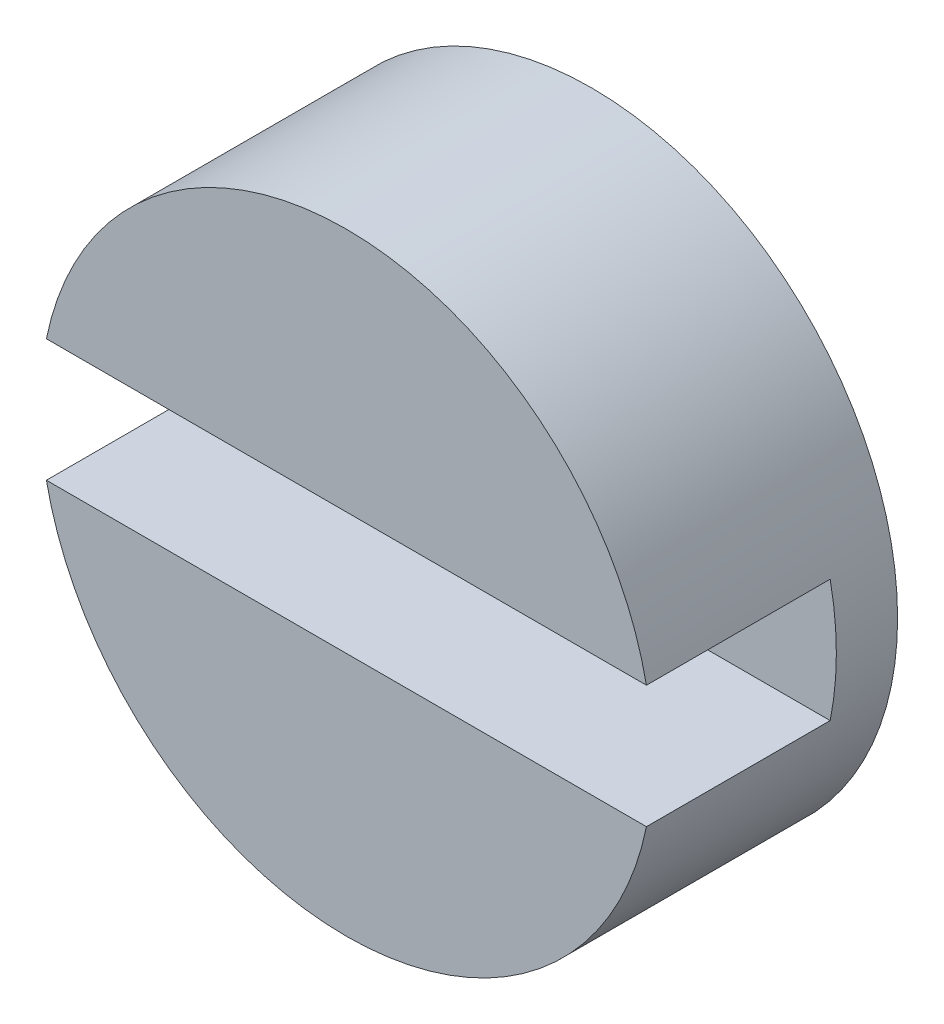
ISO-10303-21;
HEADER;
FILE_DESCRIPTION(('STEP AP214'),'2;1');
FILE_NAME('part.step','',(''),(''),'','','');
FILE_SCHEMA(('AUTOMOTIVE_DESIGN { 1 0 10303 214 1 1 1 1 }'));
ENDSEC;
DATA;
#1=APPLICATION_CONTEXT('core data for automotive mechanical design processes');
#2=APPLICATION_PROTOCOL_DEFINITION('international standard','automotive_design',2000,#1);
#3=PRODUCT_CONTEXT('',#1,'mechanical');
#4=PRODUCT('Part','Part','',(#3));
#5=PRODUCT_RELATED_PRODUCT_CATEGORY('part','',(#4));
#6=PRODUCT_DEFINITION_FORMATION('','',#4);
#7=PRODUCT_DEFINITION_CONTEXT('part definition',#1,'design');
#8=PRODUCT_DEFINITION('design','',#6,#7);
#9=PRODUCT_DEFINITION_SHAPE('','',#8);
#10=(LENGTH_UNIT() NAMED_UNIT(*) SI_UNIT(.MILLI.,.METRE.));
#11=(NAMED_UNIT(*) PLANE_ANGLE_UNIT() SI_UNIT($,.RADIAN.));
#12=(NAMED_UNIT(*) SI_UNIT($,.STERADIAN.) SOLID_ANGLE_UNIT());
#13=UNCERTAINTY_MEASURE_WITH_UNIT(LENGTH_MEASURE(1.E-05),#10,'distance_accuracy_value','');
#14=(GEOMETRIC_REPRESENTATION_CONTEXT(3) GLOBAL_UNCERTAINTY_ASSIGNED_CONTEXT((#13)) GLOBAL_UNIT_ASSIGNED_CONTEXT((#10,
#11,#12)) REPRESENTATION_CONTEXT('',''));
#15=CARTESIAN_POINT('',(0.,0.,0.));
#16=DIRECTION('',(0.,0.,1.));
#17=DIRECTION('',(1.,0.,0.));
#18=AXIS2_PLACEMENT_3D('',#15,#16,#17);
#19=CARTESIAN_POINT('',(0.,0.,20.));
#20=DIRECTION('',(0.,0.,1.));
#21=DIRECTION('',(1.,0.,0.));
#22=AXIS2_PLACEMENT_3D('',#19,#20,#21);
#23=PLANE('',#22);
#24=DIRECTION('',(1.,0.,0.));
#25=VECTOR('',#24,1.);
#26=CARTESIAN_POINT('',(0.,-5.,20.));
#27=LINE('',#26,#25);
#28=CARTESIAN_POINT('',(-24.4948974278318,-5.,20.));
#29=VERTEX_POINT('',#28);
#30=CARTESIAN_POINT('',(24.4948974278318,-5.,20.));
#31=VERTEX_POINT('',#30);
#32=EDGE_CURVE('E56',#29,#31,#27,.T.);
#33=ORIENTED_EDGE('',*,*,#32,.F.);
#34=CARTESIAN_POINT('',(0.,0.,20.));
#35=DIRECTION('',(0.,0.,1.));
#36=DIRECTION('',(1.,0.,0.));
#37=AXIS2_PLACEMENT_3D('',#34,#35,#36);
#38=CIRCLE('',#37,25.);
#39=EDGE_CURVE('E100',#29,#31,#38,.T.);
#40=ORIENTED_EDGE('',*,*,#39,.T.);
#41=EDGE_LOOP('',(#33,#40));
#42=FACE_BOUND('',#41,.T.);
#43=ADVANCED_FACE('F33',(#42),#23,.T.);
#44=CARTESIAN_POINT('',(0.,0.,20.));
#45=DIRECTION('',(0.,0.,-1.));
#46=DIRECTION('',(-1.,0.,0.));
#47=AXIS2_PLACEMENT_3D('',#44,#45,#46);
#48=CYLINDRICAL_SURFACE('',#47,25.);
#49=DIRECTION('',(0.,0.,-1.));
#50=VECTOR('',#49,1.);
#51=CARTESIAN_POINT('',(24.4948974278318,5.,20.));
#52=LINE('',#51,#50);
#53=CARTESIAN_POINT('',(24.4948974278318,5.,20.));
#54=VERTEX_POINT('',#53);
#55=CARTESIAN_POINT('',(24.4948974278318,5.,5.));
#56=VERTEX_POINT('',#55);
#57=EDGE_CURVE('E48',#54,#56,#52,.T.);
#58=ORIENTED_EDGE('',*,*,#57,.T.);
#59=CARTESIAN_POINT('',(0.,0.,5.));
#60=DIRECTION('',(0.,0.,-1.));
#61=DIRECTION('',(-1.,0.,0.));
#62=AXIS2_PLACEMENT_3D('',#59,#60,#61);
#63=CIRCLE('',#62,25.);
#64=CARTESIAN_POINT('',(24.4948974278318,-5.,5.));
#65=VERTEX_POINT('',#64);
#66=EDGE_CURVE('E37',#56,#65,#63,.T.);
#67=ORIENTED_EDGE('',*,*,#66,.T.);
#68=DIRECTION('',(0.,0.,-1.));
#69=VECTOR('',#68,1.);
#70=CARTESIAN_POINT('',(24.4948974278318,-5.,20.));
#71=LINE('',#70,#69);
#72=EDGE_CURVE('E96',#65,#31,#71,.F.);
#73=ORIENTED_EDGE('',*,*,#72,.T.);
#74=ORIENTED_EDGE('',*,*,#39,.F.);
#75=DIRECTION('',(0.,0.,-1.));
#76=VECTOR('',#75,1.);
#77=CARTESIAN_POINT('',(-24.4948974278318,-5.,20.));
#78=LINE('',#77,#76);
#79=CARTESIAN_POINT('',(-24.4948974278318,-5.,5.));
#80=VERTEX_POINT('',#79);
#81=EDGE_CURVE('E80',#29,#80,#78,.T.);
#82=ORIENTED_EDGE('',*,*,#81,.T.);
#83=CARTESIAN_POINT('',(-24.4948974278318,5.,5.));
#84=VERTEX_POINT('',#83);
#85=EDGE_CURVE('E11',#80,#84,#63,.T.);
#86=ORIENTED_EDGE('',*,*,#85,.T.);
#87=DIRECTION('',(0.,0.,-1.));
#88=VECTOR('',#87,1.);
#89=CARTESIAN_POINT('',(-24.4948974278318,5.,20.));
#90=LINE('',#89,#88);
#91=CARTESIAN_POINT('',(-24.4948974278318,5.,20.));
#92=VERTEX_POINT('',#91);
#93=EDGE_CURVE('E77',#84,#92,#90,.F.);
#94=ORIENTED_EDGE('',*,*,#93,.T.);
#95=EDGE_CURVE('E103',#54,#92,#38,.T.);
#96=ORIENTED_EDGE('',*,*,#95,.F.);
#97=EDGE_LOOP('',(#58,#67,#73,#74,#82,#86,#94,#96));
#98=FACE_BOUND('',#97,.T.);
#99=CARTESIAN_POINT('',(0.,0.,0.));
#100=DIRECTION('',(0.,0.,1.));
#101=DIRECTION('',(1.,0.,0.));
#102=AXIS2_PLACEMENT_3D('',#99,#100,#101);
#103=CIRCLE('',#102,25.);
#104=CARTESIAN_POINT('',(25.,0.,0.));
#105=VERTEX_POINT('',#104);
#106=EDGE_CURVE('E99',#105,#105,#103,.T.);
#107=ORIENTED_EDGE('',*,*,#106,.T.);
#108=EDGE_LOOP('',(#107));
#109=FACE_BOUND('',#108,.T.);
#110=ADVANCED_FACE('F35',(#98,#109),#48,.T.);
#111=DIRECTION('',(-1.,0.,0.));
#112=VECTOR('',#111,1.);
#113=CARTESIAN_POINT('',(0.,5.,20.));
#114=LINE('',#113,#112);
#115=EDGE_CURVE('E87',#54,#92,#114,.T.);
#116=ORIENTED_EDGE('',*,*,#115,.F.);
#117=ORIENTED_EDGE('',*,*,#95,.T.);
#118=EDGE_LOOP('',(#116,#117));
#119=FACE_BOUND('',#118,.T.);
#120=ADVANCED_FACE('F107',(#119),#23,.T.);
#121=CARTESIAN_POINT('',(0.,0.,0.));
#122=DIRECTION('',(0.,0.,1.));
#123=DIRECTION('',(1.,0.,0.));
#124=AXIS2_PLACEMENT_3D('',#121,#122,#123);
#125=PLANE('',#124);
#126=ORIENTED_EDGE('',*,*,#106,.F.);
#127=EDGE_LOOP('',(#126));
#128=FACE_BOUND('',#127,.T.);
#129=ADVANCED_FACE('F109',(#128),#125,.F.);
#130=CARTESIAN_POINT('',(-25.,-5.,5.));
#131=DIRECTION('',(0.,0.,-1.));
#132=DIRECTION('',(-1.,0.,0.));
#133=AXIS2_PLACEMENT_3D('',#130,#131,#132);
#134=PLANE('',#133);
#135=DIRECTION('',(1.,0.,0.));
#136=VECTOR('',#135,1.);
#137=CARTESIAN_POINT('',(-25.,5.,5.));
#138=LINE('',#137,#136);
#139=EDGE_CURVE('E86',#84,#56,#138,.T.);
#140=ORIENTED_EDGE('',*,*,#139,.F.);
#141=ORIENTED_EDGE('',*,*,#85,.F.);
#142=DIRECTION('',(1.,0.,0.));
#143=VECTOR('',#142,1.);
#144=CARTESIAN_POINT('',(-25.,-5.,5.));
#145=LINE('',#144,#143);
#146=EDGE_CURVE('E88',#80,#65,#145,.T.);
#147=ORIENTED_EDGE('',*,*,#146,.T.);
#148=ORIENTED_EDGE('',*,*,#66,.F.);
#149=EDGE_LOOP('',(#140,#141,#147,#148));
#150=FACE_BOUND('',#149,.T.);
#151=ADVANCED_FACE('F90',(#150),#134,.F.);
#152=CARTESIAN_POINT('',(-25.,-5.,35.));
#153=DIRECTION('',(0.,-1.,0.));
#154=DIRECTION('',(0.,0.,-1.));
#155=AXIS2_PLACEMENT_3D('',#152,#153,#154);
#156=PLANE('',#155);
#157=ORIENTED_EDGE('',*,*,#32,.T.);
#158=ORIENTED_EDGE('',*,*,#72,.F.);
#159=ORIENTED_EDGE('',*,*,#146,.F.);
#160=ORIENTED_EDGE('',*,*,#81,.F.);
#161=EDGE_LOOP('',(#157,#158,#159,#160));
#162=FACE_BOUND('',#161,.T.);
#163=ADVANCED_FACE('F140',(#162),#156,.F.);
#164=CARTESIAN_POINT('',(-25.,5.,35.));
#165=DIRECTION('',(0.,1.,0.));
#166=DIRECTION('',(0.,0.,1.));
#167=AXIS2_PLACEMENT_3D('',#164,#165,#166);
#168=PLANE('',#167);
#169=ORIENTED_EDGE('',*,*,#115,.T.);
#170=ORIENTED_EDGE('',*,*,#93,.F.);
#171=ORIENTED_EDGE('',*,*,#139,.T.);
#172=ORIENTED_EDGE('',*,*,#57,.F.);
#173=EDGE_LOOP('',(#169,#170,#171,#172));
#174=FACE_BOUND('',#173,.T.);
#175=ADVANCED_FACE('F85',(#174),#168,.F.);
#176=CLOSED_SHELL('',(#43,#110,#120,#129,#151,#163,#175));
#177=MANIFOLD_SOLID_BREP('B2',#176);
#178=ADVANCED_BREP_SHAPE_REPRESENTATION('',(#18,#177),#14);
#179=SHAPE_DEFINITION_REPRESENTATION(#9,#178);
ENDSEC;
END-ISO-10303-21;
